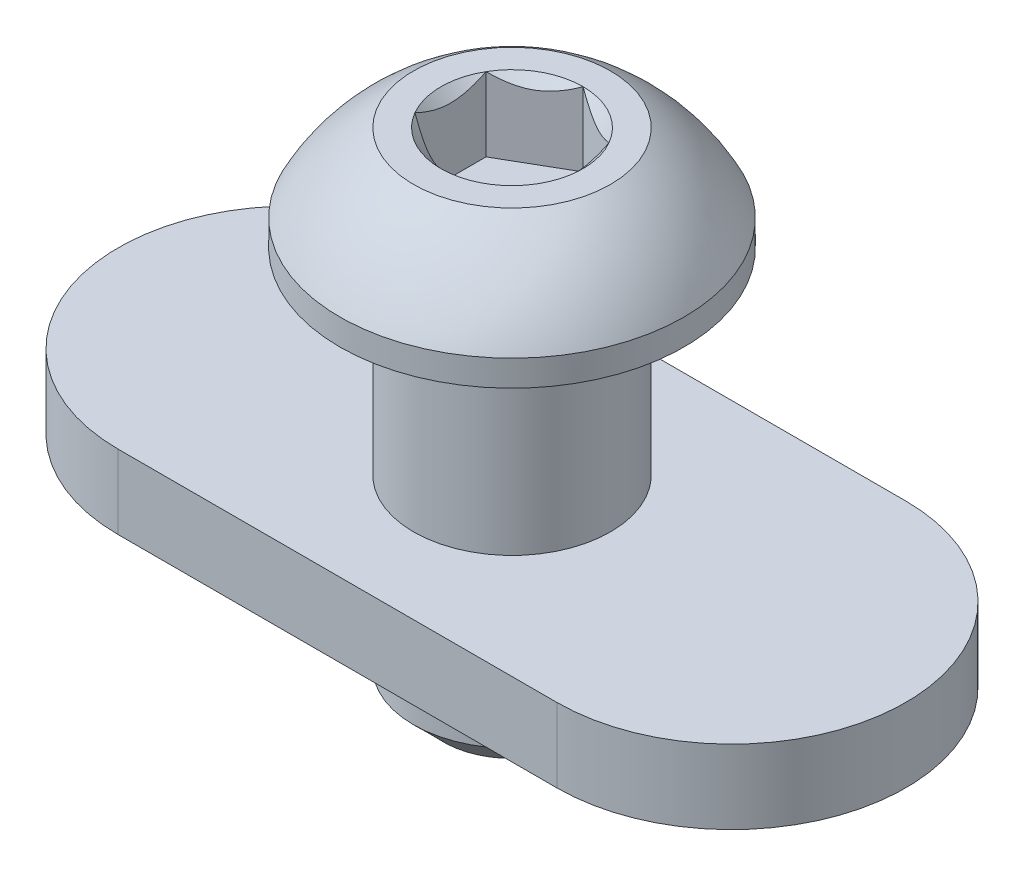
ISO-10303-21;
HEADER;
FILE_DESCRIPTION(('STEP AP214'),'2;1');
FILE_NAME('part.step','',(''),(''),'','','');
FILE_SCHEMA(('AUTOMOTIVE_DESIGN { 1 0 10303 214 1 1 1 1 }'));
ENDSEC;
DATA;
#1=APPLICATION_CONTEXT('core data for automotive mechanical design processes');
#2=APPLICATION_PROTOCOL_DEFINITION('international standard','automotive_design',2000,#1);
#3=PRODUCT_CONTEXT('',#1,'mechanical');
#4=PRODUCT('Part','Part','',(#3));
#5=PRODUCT_RELATED_PRODUCT_CATEGORY('part','',(#4));
#6=PRODUCT_DEFINITION_FORMATION('','',#4);
#7=PRODUCT_DEFINITION_CONTEXT('part definition',#1,'design');
#8=PRODUCT_DEFINITION('design','',#6,#7);
#9=PRODUCT_DEFINITION_SHAPE('','',#8);
#10=(LENGTH_UNIT() NAMED_UNIT(*) SI_UNIT(.MILLI.,.METRE.));
#11=(NAMED_UNIT(*) PLANE_ANGLE_UNIT() SI_UNIT($,.RADIAN.));
#12=(NAMED_UNIT(*) SI_UNIT($,.STERADIAN.) SOLID_ANGLE_UNIT());
#13=UNCERTAINTY_MEASURE_WITH_UNIT(LENGTH_MEASURE(1.E-05),#10,'distance_accuracy_value','');
#14=(GEOMETRIC_REPRESENTATION_CONTEXT(3) GLOBAL_UNCERTAINTY_ASSIGNED_CONTEXT((#13)) GLOBAL_UNIT_ASSIGNED_CONTEXT((#10,
#11,#12)) REPRESENTATION_CONTEXT('',''));
#15=CARTESIAN_POINT('',(0.,0.,0.));
#16=DIRECTION('',(0.,0.,1.));
#17=DIRECTION('',(1.,0.,0.));
#18=AXIS2_PLACEMENT_3D('',#15,#16,#17);
#19=CARTESIAN_POINT('',(-7.0739,-8.7376,0.));
#20=DIRECTION('',(0.,1.,0.));
#21=DIRECTION('',(0.,0.,1.));
#22=AXIS2_PLACEMENT_3D('',#19,#20,#21);
#23=PLANE('',#22);
#24=CARTESIAN_POINT('',(-7.0739,-8.7376,0.));
#25=DIRECTION('',(0.,1.,0.));
#26=DIRECTION('',(0.,0.,1.));
#27=AXIS2_PLACEMENT_3D('',#24,#25,#26);
#28=CIRCLE('',#27,5.6261);
#29=CARTESIAN_POINT('',(-7.0739,-8.7376,-5.6261));
#30=VERTEX_POINT('',#29);
#31=CARTESIAN_POINT('',(-7.0739,-8.7376,5.6261));
#32=VERTEX_POINT('',#31);
#33=EDGE_CURVE('E113',#30,#32,#28,.T.);
#34=ORIENTED_EDGE('',*,*,#33,.F.);
#35=DIRECTION('',(-1.,0.,0.));
#36=VECTOR('',#35,1.);
#37=CARTESIAN_POINT('',(-7.0739,-8.7376,-5.6261));
#38=LINE('',#37,#36);
#39=CARTESIAN_POINT('',(7.0739,-8.7376,-5.6261));
#40=VERTEX_POINT('',#39);
#41=EDGE_CURVE('E110',#40,#30,#38,.T.);
#42=ORIENTED_EDGE('',*,*,#41,.F.);
#43=CARTESIAN_POINT('',(7.0739,-8.7376,0.));
#44=DIRECTION('',(0.,1.,0.));
#45=DIRECTION('',(0.,0.,1.));
#46=AXIS2_PLACEMENT_3D('',#43,#44,#45);
#47=CIRCLE('',#46,5.6261);
#48=CARTESIAN_POINT('',(7.0739,-8.7376,5.6261));
#49=VERTEX_POINT('',#48);
#50=EDGE_CURVE('E102',#49,#40,#47,.T.);
#51=ORIENTED_EDGE('',*,*,#50,.F.);
#52=DIRECTION('',(1.,0.,0.));
#53=VECTOR('',#52,1.);
#54=CARTESIAN_POINT('',(-7.0739,-8.7376,5.6261));
#55=LINE('',#54,#53);
#56=EDGE_CURVE('E109',#32,#49,#55,.T.);
#57=ORIENTED_EDGE('',*,*,#56,.F.);
#58=EDGE_LOOP('',(#34,#42,#51,#57));
#59=FACE_BOUND('',#58,.T.);
#60=CARTESIAN_POINT('',(0.,-8.7376,0.));
#61=DIRECTION('',(0.,1.,0.));
#62=DIRECTION('',(0.,0.,1.));
#63=AXIS2_PLACEMENT_3D('',#60,#61,#62);
#64=CIRCLE('',#63,3.5687);
#65=CARTESIAN_POINT('',(0.,-8.7376,3.5687));
#66=VERTEX_POINT('',#65);
#67=EDGE_CURVE('E13',#66,#66,#64,.F.);
#68=ORIENTED_EDGE('',*,*,#67,.F.);
#69=EDGE_LOOP('',(#68));
#70=FACE_BOUND('',#69,.T.);
#71=ADVANCED_FACE('F52',(#59,#70),#23,.F.);
#72=CARTESIAN_POINT('',(-7.0739,-8.7376,0.));
#73=DIRECTION('',(0.,1.,0.));
#74=DIRECTION('',(0.,0.,1.));
#75=AXIS2_PLACEMENT_3D('',#72,#73,#74);
#76=CYLINDRICAL_SURFACE('',#75,5.6261);
#77=CARTESIAN_POINT('',(-7.0739,-6.35,0.));
#78=DIRECTION('',(0.,1.,0.));
#79=DIRECTION('',(0.,0.,1.));
#80=AXIS2_PLACEMENT_3D('',#77,#78,#79);
#81=CIRCLE('',#80,5.6261);
#82=CARTESIAN_POINT('',(-7.0739,-6.35,-5.6261));
#83=VERTEX_POINT('',#82);
#84=CARTESIAN_POINT('',(-7.0739,-6.35,5.6261));
#85=VERTEX_POINT('',#84);
#86=EDGE_CURVE('E120',#83,#85,#81,.T.);
#87=ORIENTED_EDGE('',*,*,#86,.F.);
#88=DIRECTION('',(0.,1.,0.));
#89=VECTOR('',#88,1.);
#90=CARTESIAN_POINT('',(-7.0739,-8.7376,-5.6261));
#91=LINE('',#90,#89);
#92=EDGE_CURVE('E61',#30,#83,#91,.T.);
#93=ORIENTED_EDGE('',*,*,#92,.F.);
#94=ORIENTED_EDGE('',*,*,#33,.T.);
#95=DIRECTION('',(0.,1.,0.));
#96=VECTOR('',#95,1.);
#97=CARTESIAN_POINT('',(-7.0739,-8.7376,5.6261));
#98=LINE('',#97,#96);
#99=EDGE_CURVE('E96',#32,#85,#98,.T.);
#100=ORIENTED_EDGE('',*,*,#99,.T.);
#101=EDGE_LOOP('',(#87,#93,#94,#100));
#102=FACE_BOUND('',#101,.T.);
#103=ADVANCED_FACE('F54',(#102),#76,.T.);
#104=CARTESIAN_POINT('',(-7.0739,-8.7376,-5.6261));
#105=DIRECTION('',(0.,0.,-1.));
#106=DIRECTION('',(-1.,0.,0.));
#107=AXIS2_PLACEMENT_3D('',#104,#105,#106);
#108=PLANE('',#107);
#109=DIRECTION('',(-1.,0.,0.));
#110=VECTOR('',#109,1.);
#111=CARTESIAN_POINT('',(-7.0739,-6.35,-5.6261));
#112=LINE('',#111,#110);
#113=CARTESIAN_POINT('',(7.0739,-6.35,-5.6261));
#114=VERTEX_POINT('',#113);
#115=EDGE_CURVE('E115',#114,#83,#112,.T.);
#116=ORIENTED_EDGE('',*,*,#115,.F.);
#117=DIRECTION('',(0.,1.,0.));
#118=VECTOR('',#117,1.);
#119=CARTESIAN_POINT('',(7.0739,-8.7376,-5.6261));
#120=LINE('',#119,#118);
#121=EDGE_CURVE('E85',#40,#114,#120,.T.);
#122=ORIENTED_EDGE('',*,*,#121,.F.);
#123=ORIENTED_EDGE('',*,*,#41,.T.);
#124=ORIENTED_EDGE('',*,*,#92,.T.);
#125=EDGE_LOOP('',(#116,#122,#123,#124));
#126=FACE_BOUND('',#125,.T.);
#127=ADVANCED_FACE('F132',(#126),#108,.T.);
#128=CARTESIAN_POINT('',(7.0739,-8.7376,0.));
#129=DIRECTION('',(0.,1.,0.));
#130=DIRECTION('',(0.,0.,1.));
#131=AXIS2_PLACEMENT_3D('',#128,#129,#130);
#132=CYLINDRICAL_SURFACE('',#131,5.6261);
#133=CARTESIAN_POINT('',(7.0739,-6.35,0.));
#134=DIRECTION('',(0.,1.,0.));
#135=DIRECTION('',(0.,0.,1.));
#136=AXIS2_PLACEMENT_3D('',#133,#134,#135);
#137=CIRCLE('',#136,5.6261);
#138=CARTESIAN_POINT('',(7.0739,-6.35,5.6261));
#139=VERTEX_POINT('',#138);
#140=EDGE_CURVE('E104',#139,#114,#137,.T.);
#141=ORIENTED_EDGE('',*,*,#140,.F.);
#142=DIRECTION('',(0.,1.,0.));
#143=VECTOR('',#142,1.);
#144=CARTESIAN_POINT('',(7.0739,-8.7376,5.6261));
#145=LINE('',#144,#143);
#146=EDGE_CURVE('E99',#49,#139,#145,.T.);
#147=ORIENTED_EDGE('',*,*,#146,.F.);
#148=ORIENTED_EDGE('',*,*,#50,.T.);
#149=ORIENTED_EDGE('',*,*,#121,.T.);
#150=EDGE_LOOP('',(#141,#147,#148,#149));
#151=FACE_BOUND('',#150,.T.);
#152=ADVANCED_FACE('F101',(#151),#132,.T.);
#153=CARTESIAN_POINT('',(-7.0739,-8.7376,5.6261));
#154=DIRECTION('',(0.,0.,1.));
#155=DIRECTION('',(1.,0.,0.));
#156=AXIS2_PLACEMENT_3D('',#153,#154,#155);
#157=PLANE('',#156);
#158=DIRECTION('',(1.,0.,0.));
#159=VECTOR('',#158,1.);
#160=CARTESIAN_POINT('',(-7.0739,-6.35,5.6261));
#161=LINE('',#160,#159);
#162=EDGE_CURVE('E123',#85,#139,#161,.T.);
#163=ORIENTED_EDGE('',*,*,#162,.F.);
#164=ORIENTED_EDGE('',*,*,#99,.F.);
#165=ORIENTED_EDGE('',*,*,#56,.T.);
#166=ORIENTED_EDGE('',*,*,#146,.T.);
#167=EDGE_LOOP('',(#163,#164,#165,#166));
#168=FACE_BOUND('',#167,.T.);
#169=ADVANCED_FACE('F112',(#168),#157,.T.);
#170=CARTESIAN_POINT('',(-7.0739,-6.35,0.));
#171=DIRECTION('',(0.,1.,0.));
#172=DIRECTION('',(0.,0.,1.));
#173=AXIS2_PLACEMENT_3D('',#170,#171,#172);
#174=PLANE('',#173);
#175=CARTESIAN_POINT('',(0.,-6.35,0.));
#176=DIRECTION('',(0.,1.,0.));
#177=DIRECTION('',(0.,0.,1.));
#178=AXIS2_PLACEMENT_3D('',#175,#176,#177);
#179=CIRCLE('',#178,3.175);
#180=CARTESIAN_POINT('',(0.,-6.35,3.175));
#181=VERTEX_POINT('',#180);
#182=EDGE_CURVE('E124',#181,#181,#179,.T.);
#183=ORIENTED_EDGE('',*,*,#182,.F.);
#184=EDGE_LOOP('',(#183));
#185=FACE_BOUND('',#184,.T.);
#186=ORIENTED_EDGE('',*,*,#86,.T.);
#187=ORIENTED_EDGE('',*,*,#162,.T.);
#188=ORIENTED_EDGE('',*,*,#140,.T.);
#189=ORIENTED_EDGE('',*,*,#115,.T.);
#190=EDGE_LOOP('',(#186,#187,#188,#189));
#191=FACE_BOUND('',#190,.T.);
#192=ADVANCED_FACE('F131',(#185,#191),#174,.T.);
#193=CARTESIAN_POINT('',(0.,-8.7376,0.));
#194=DIRECTION('',(0.,1.,0.));
#195=DIRECTION('',(0.,0.,1.));
#196=AXIS2_PLACEMENT_3D('',#193,#194,#195);
#197=CYLINDRICAL_SURFACE('',#196,3.175);
#198=ORIENTED_EDGE('',*,*,#182,.T.);
#199=EDGE_LOOP('',(#198));
#200=FACE_BOUND('',#199,.T.);
#201=CARTESIAN_POINT('',(0.,-9.4996,0.));
#202=DIRECTION('',(0.,-1.,0.));
#203=DIRECTION('',(0.,0.,-1.));
#204=AXIS2_PLACEMENT_3D('',#201,#202,#203);
#205=CIRCLE('',#204,3.175);
#206=CARTESIAN_POINT('',(0.,-9.4996,-3.175));
#207=VERTEX_POINT('',#206);
#208=EDGE_CURVE('E160',#207,#207,#205,.T.);
#209=ORIENTED_EDGE('',*,*,#208,.T.);
#210=EDGE_LOOP('',(#209));
#211=FACE_BOUND('',#210,.T.);
#212=ADVANCED_FACE('F146',(#200,#211),#197,.F.);
#213=CARTESIAN_POINT('',(0.,-9.4996,0.));
#214=DIRECTION('',(0.,-1.,0.));
#215=DIRECTION('',(0.,0.,-1.));
#216=AXIS2_PLACEMENT_3D('',#213,#214,#215);
#217=PLANE('',#216);
#218=CARTESIAN_POINT('',(0.,-9.4996,0.));
#219=DIRECTION('',(0.,-1.,0.));
#220=DIRECTION('',(0.,0.,-1.));
#221=AXIS2_PLACEMENT_3D('',#218,#219,#220);
#222=CIRCLE('',#221,3.5687);
#223=CARTESIAN_POINT('',(0.,-9.4996,3.5687));
#224=VERTEX_POINT('',#223);
#225=EDGE_CURVE('E158',#224,#224,#222,.T.);
#226=ORIENTED_EDGE('',*,*,#225,.T.);
#227=EDGE_LOOP('',(#226));
#228=FACE_BOUND('',#227,.T.);
#229=ORIENTED_EDGE('',*,*,#208,.F.);
#230=EDGE_LOOP('',(#229));
#231=FACE_BOUND('',#230,.T.);
#232=ADVANCED_FACE('F154',(#228,#231),#217,.T.);
#233=CARTESIAN_POINT('',(0.,-9.4996,0.));
#234=DIRECTION('',(0.,1.,0.));
#235=DIRECTION('',(0.,0.,1.));
#236=AXIS2_PLACEMENT_3D('',#233,#234,#235);
#237=CYLINDRICAL_SURFACE('',#236,3.5687);
#238=CARTESIAN_POINT('',(0.,-9.4996,3.5687));
#239=CARTESIAN_POINT('',(0.,-9.4916625,3.5687));
#240=CARTESIAN_POINT('',(0.,-9.483725,3.5687));
#241=CARTESIAN_POINT('',(0.,-9.46785,3.5687));
#242=CARTESIAN_POINT('',(0.,-9.4599125,3.5687));
#243=CARTESIAN_POINT('',(0.,-9.4440375,3.5687));
#244=CARTESIAN_POINT('',(0.,-9.4361,3.5687));
#245=CARTESIAN_POINT('',(0.,-9.420225,3.5687));
#246=CARTESIAN_POINT('',(0.,-9.4122875,3.5687));
#247=CARTESIAN_POINT('',(0.,-9.3964125,3.5687));
#248=CARTESIAN_POINT('',(0.,-9.388475,3.5687));
#249=CARTESIAN_POINT('',(0.,-9.3726,3.5687));
#250=CARTESIAN_POINT('',(0.,-9.3646625,3.5687));
#251=CARTESIAN_POINT('',(0.,-9.3487875,3.5687));
#252=CARTESIAN_POINT('',(0.,-9.34085,3.5687));
#253=CARTESIAN_POINT('',(0.,-9.324975,3.5687));
#254=CARTESIAN_POINT('',(0.,-9.3170375,3.5687));
#255=CARTESIAN_POINT('',(0.,-9.3011625,3.5687));
#256=CARTESIAN_POINT('',(0.,-9.293225,3.5687));
#257=CARTESIAN_POINT('',(0.,-9.27735,3.5687));
#258=CARTESIAN_POINT('',(0.,-9.2694125,3.5687));
#259=CARTESIAN_POINT('',(0.,-9.2535375,3.5687));
#260=CARTESIAN_POINT('',(0.,-9.2456,3.5687));
#261=CARTESIAN_POINT('',(0.,-9.229725,3.5687));
#262=CARTESIAN_POINT('',(0.,-9.2217875,3.5687));
#263=CARTESIAN_POINT('',(0.,-9.2059125,3.5687));
#264=CARTESIAN_POINT('',(0.,-9.197975,3.5687));
#265=CARTESIAN_POINT('',(0.,-9.1821,3.5687));
#266=CARTESIAN_POINT('',(0.,-9.1741625,3.5687));
#267=CARTESIAN_POINT('',(0.,-9.1582875,3.5687));
#268=CARTESIAN_POINT('',(0.,-9.15035,3.5687));
#269=CARTESIAN_POINT('',(0.,-9.134475,3.5687));
#270=CARTESIAN_POINT('',(0.,-9.1265375,3.5687));
#271=CARTESIAN_POINT('',(0.,-9.1106625,3.5687));
#272=CARTESIAN_POINT('',(0.,-9.102725,3.5687));
#273=CARTESIAN_POINT('',(0.,-9.08685,3.5687));
#274=CARTESIAN_POINT('',(0.,-9.0789125,3.5687));
#275=CARTESIAN_POINT('',(0.,-9.0630375,3.5687));
#276=CARTESIAN_POINT('',(0.,-9.0551,3.5687));
#277=CARTESIAN_POINT('',(0.,-9.039225,3.5687));
#278=CARTESIAN_POINT('',(0.,-9.0312875,3.5687));
#279=CARTESIAN_POINT('',(0.,-9.0154125,3.5687));
#280=CARTESIAN_POINT('',(0.,-9.007475,3.5687));
#281=CARTESIAN_POINT('',(0.,-8.9916,3.5687));
#282=CARTESIAN_POINT('',(0.,-8.9836625,3.5687));
#283=CARTESIAN_POINT('',(0.,-8.9677875,3.5687));
#284=CARTESIAN_POINT('',(0.,-8.95985,3.5687));
#285=CARTESIAN_POINT('',(0.,-8.943975,3.5687));
#286=CARTESIAN_POINT('',(0.,-8.9360375,3.5687));
#287=CARTESIAN_POINT('',(0.,-8.9201625,3.5687));
#288=CARTESIAN_POINT('',(0.,-8.912225,3.5687));
#289=CARTESIAN_POINT('',(0.,-8.89635,3.5687));
#290=CARTESIAN_POINT('',(0.,-8.8884125,3.5687));
#291=CARTESIAN_POINT('',(0.,-8.8725375,3.5687));
#292=CARTESIAN_POINT('',(0.,-8.8646,3.5687));
#293=CARTESIAN_POINT('',(0.,-8.848725,3.5687));
#294=CARTESIAN_POINT('',(0.,-8.8407875,3.5687));
#295=CARTESIAN_POINT('',(0.,-8.8249125,3.5687));
#296=CARTESIAN_POINT('',(0.,-8.816975,3.5687));
#297=CARTESIAN_POINT('',(0.,-8.8011,3.5687));
#298=CARTESIAN_POINT('',(0.,-8.7931625,3.5687));
#299=CARTESIAN_POINT('',(0.,-8.7772875,3.5687));
#300=CARTESIAN_POINT('',(0.,-8.76935,3.5687));
#301=CARTESIAN_POINT('',(0.,-8.753475,3.5687));
#302=CARTESIAN_POINT('',(0.,-8.7455375,3.5687));
#303=CARTESIAN_POINT('',(0.,-8.7376,3.5687));
#304=B_SPLINE_CURVE_WITH_KNOTS('',3,(#238,#239,#240,#241,#242,#243,#244,#245,#246,#247,#248,
#249,#250,#251,#252,#253,#254,#255,#256,#257,#258,#259,#260,#261,#262,#263,#264,#265,#266,#267,
#268,#269,#270,#271,#272,#273,#274,#275,#276,#277,#278,#279,#280,#281,#282,#283,#284,#285,#286,
#287,#288,#289,#290,#291,#292,#293,#294,#295,#296,#297,#298,#299,#300,#301,#302,#303),
.UNSPECIFIED.,.F.,.F.,(4,2,2,2,2,2,2,2,2,2,2,2,2,2,2,2,2,2,2,2,2,2,2,2,2,2,2,2,2,2,2,2,4),(0.,
0.0238125000000013,0.0476250000000008,0.0714375000000003,0.0952499999999998,0.119062500000001,
0.142875000000001,0.1666875,0.1905,0.214312500000001,0.238125,0.2619375,0.28575,
0.309562500000001,0.333375,0.3571875,0.380999999999999,0.404812500000001,0.428625,0.4524375,
0.476249999999999,0.500062500000001,0.523875,0.5476875,0.571499999999999,0.5953125,0.619125,
0.642937499999999,0.666749999999999,0.6905625,0.714375,0.738187499999999,0.761999999999999),.UNSPECIFIED.);
#305=EDGE_CURVE('BSEAM168',#224,#66,#304,.T.);
#306=ORIENTED_EDGE('',*,*,#225,.F.);
#307=ORIENTED_EDGE('',*,*,#67,.T.);
#308=ORIENTED_EDGE('',*,*,#305,.T.);
#309=ORIENTED_EDGE('',*,*,#305,.F.);
#310=EDGE_LOOP('',(#306,#308,#307,#309));
#311=FACE_BOUND('',#310,.T.);
#312=ADVANCED_FACE('F168',(#311),#237,.T.);
#313=CLOSED_SHELL('',(#71,#103,#127,#152,#169,#192,#212,#232,#312));
#314=MANIFOLD_SOLID_BREP('B2',#313);
#315=CARTESIAN_POINT('',(0.,-12.7,0.));
#316=DIRECTION('',(0.,1.,0.));
#317=DIRECTION('',(0.,0.,1.));
#318=AXIS2_PLACEMENT_3D('',#315,#316,#317);
#319=CYLINDRICAL_SURFACE('',#318,3.175);
#320=CARTESIAN_POINT('',(0.,0.,0.));
#321=DIRECTION('',(0.,1.,0.));
#322=DIRECTION('',(0.,0.,1.));
#323=AXIS2_PLACEMENT_3D('',#320,#321,#322);
#324=CIRCLE('',#323,3.175);
#325=CARTESIAN_POINT('',(0.,0.,3.175));
#326=VERTEX_POINT('',#325);
#327=EDGE_CURVE('E244',#326,#326,#324,.T.);
#328=ORIENTED_EDGE('',*,*,#327,.F.);
#329=EDGE_LOOP('',(#328));
#330=FACE_BOUND('',#329,.T.);
#331=CARTESIAN_POINT('',(0.,-11.7376292700446,0.));
#332=DIRECTION('',(0.,1.,0.));
#333=DIRECTION('',(0.,0.,1.));
#334=AXIS2_PLACEMENT_3D('',#331,#332,#333);
#335=CIRCLE('',#334,3.175);
#336=CARTESIAN_POINT('',(0.,-11.7376292700446,3.175));
#337=VERTEX_POINT('',#336);
#338=EDGE_CURVE('E373',#337,#337,#335,.T.);
#339=ORIENTED_EDGE('',*,*,#338,.T.);
#340=EDGE_LOOP('',(#339));
#341=FACE_BOUND('',#340,.T.);
#342=ADVANCED_FACE('F230',(#330,#341),#319,.T.);
#343=CARTESIAN_POINT('',(0.,-12.7,0.));
#344=DIRECTION('',(0.,1.,0.));
#345=DIRECTION('',(0.,0.,-1.));
#346=AXIS2_PLACEMENT_3D('',#343,#344,#345);
#347=CONICAL_SURFACE('',#346,2.21262927004457,0.78539816339745);
#348=ORIENTED_EDGE('',*,*,#338,.F.);
#349=EDGE_LOOP('',(#348));
#350=FACE_BOUND('',#349,.T.);
#351=CARTESIAN_POINT('',(0.,-12.7,0.));
#352=DIRECTION('',(0.,-1.,0.));
#353=DIRECTION('',(0.,0.,-1.));
#354=AXIS2_PLACEMENT_3D('',#351,#352,#353);
#355=CIRCLE('',#354,2.21262927004457);
#356=CARTESIAN_POINT('',(0.,-12.7,-2.21262927004457));
#357=VERTEX_POINT('',#356);
#358=EDGE_CURVE('E369',#357,#357,#355,.T.);
#359=ORIENTED_EDGE('',*,*,#358,.F.);
#360=EDGE_LOOP('',(#359));
#361=FACE_BOUND('',#360,.T.);
#362=ADVANCED_FACE('F385',(#350,#361),#347,.T.);
#363=CARTESIAN_POINT('',(0.,-12.7,0.));
#364=DIRECTION('',(0.,1.,0.));
#365=DIRECTION('',(0.,0.,1.));
#366=AXIS2_PLACEMENT_3D('',#363,#364,#365);
#367=PLANE('',#366);
#368=ORIENTED_EDGE('',*,*,#358,.T.);
#369=EDGE_LOOP('',(#368));
#370=FACE_BOUND('',#369,.T.);
#371=ADVANCED_FACE('F390',(#370),#367,.F.);
#372=CARTESIAN_POINT('',(5.5499,0.,0.));
#373=DIRECTION('',(0.,1.,0.));
#374=DIRECTION('',(0.,0.,1.));
#375=AXIS2_PLACEMENT_3D('',#372,#373,#374);
#376=PLANE('',#375);
#377=ORIENTED_EDGE('',*,*,#327,.T.);
#378=EDGE_LOOP('',(#377));
#379=FACE_BOUND('',#378,.T.);
#380=CARTESIAN_POINT('',(0.,0.,0.));
#381=DIRECTION('',(0.,-1.,0.));
#382=DIRECTION('',(0.,0.,-1.));
#383=AXIS2_PLACEMENT_3D('',#380,#381,#382);
#384=CIRCLE('',#383,5.5499);
#385=CARTESIAN_POINT('',(0.,0.,-5.5499));
#386=VERTEX_POINT('',#385);
#387=EDGE_CURVE('E343',#386,#386,#384,.T.);
#388=ORIENTED_EDGE('',*,*,#387,.T.);
#389=EDGE_LOOP('',(#388));
#390=FACE_BOUND('',#389,.T.);
#391=ADVANCED_FACE('F380',(#379,#390),#376,.F.);
#392=CARTESIAN_POINT('',(0.,3.3528,0.));
#393=DIRECTION('',(0.,-1.,0.));
#394=DIRECTION('',(0.,0.,-1.));
#395=AXIS2_PLACEMENT_3D('',#392,#393,#394);
#396=PLANE('',#395);
#397=CARTESIAN_POINT('',(0.,3.3528,0.));
#398=DIRECTION('',(0.,1.,0.));
#399=DIRECTION('',(0.,0.,1.));
#400=AXIS2_PLACEMENT_3D('',#397,#398,#399);
#401=CIRCLE('',#400,2.29135888084633);
#402=CARTESIAN_POINT('',(0.,3.3528,-2.29135888084633));
#403=VERTEX_POINT('',#402);
#404=CARTESIAN_POINT('',(-1.984375,3.3528,-1.14567944042316));
#405=VERTEX_POINT('',#404);
#406=EDGE_CURVE('E494',#403,#405,#401,.T.);
#407=ORIENTED_EDGE('',*,*,#406,.F.);
#408=CARTESIAN_POINT('',(1.984375,3.3528,-1.14567944042317));
#409=VERTEX_POINT('',#408);
#410=EDGE_CURVE('E488',#409,#403,#401,.T.);
#411=ORIENTED_EDGE('',*,*,#410,.F.);
#412=CARTESIAN_POINT('',(1.984375,3.3528,1.14567944042316));
#413=VERTEX_POINT('',#412);
#414=EDGE_CURVE('E250',#413,#409,#401,.T.);
#415=ORIENTED_EDGE('',*,*,#414,.F.);
#416=CARTESIAN_POINT('',(0.,3.3528,2.29135888084633));
#417=VERTEX_POINT('',#416);
#418=EDGE_CURVE('E257',#417,#413,#401,.T.);
#419=ORIENTED_EDGE('',*,*,#418,.F.);
#420=CARTESIAN_POINT('',(-1.984375,3.3528,1.14567944042316));
#421=VERTEX_POINT('',#420);
#422=EDGE_CURVE('E484',#421,#417,#401,.T.);
#423=ORIENTED_EDGE('',*,*,#422,.F.);
#424=EDGE_CURVE('E490',#405,#421,#401,.T.);
#425=ORIENTED_EDGE('',*,*,#424,.F.);
#426=EDGE_LOOP('',(#407,#411,#415,#419,#423,#425));
#427=FACE_BOUND('',#426,.T.);
#428=CARTESIAN_POINT('',(0.,3.3528,0.));
#429=DIRECTION('',(0.,-1.,0.));
#430=DIRECTION('',(0.,0.,-1.));
#431=AXIS2_PLACEMENT_3D('',#428,#429,#430);
#432=CIRCLE('',#431,3.175);
#433=CARTESIAN_POINT('',(3.175,3.3528,0.));
#434=VERTEX_POINT('',#433);
#435=EDGE_CURVE('E365',#434,#434,#432,.T.);
#436=ORIENTED_EDGE('',*,*,#435,.F.);
#437=EDGE_LOOP('',(#436));
#438=FACE_BOUND('',#437,.T.);
#439=ADVANCED_FACE('F398',(#427,#438),#396,.F.);
#440=CARTESIAN_POINT('',(0.,-2.02459166666667,0.));
#441=DIRECTION('',(0.,-1.,0.));
#442=DIRECTION('',(1.,0.,0.));
#443=AXIS2_PLACEMENT_3D('',#440,#441,#442);
#444=SPHERICAL_SURFACE('',#443,6.2447550902126);
#445=CARTESIAN_POINT('',(0.,0.838200000000001,0.));
#446=DIRECTION('',(0.,-1.,0.));
#447=DIRECTION('',(0.,0.,-1.));
#448=AXIS2_PLACEMENT_3D('',#445,#446,#447);
#449=CIRCLE('',#448,5.5499);
#450=CARTESIAN_POINT('',(5.5499,0.838200000000001,0.));
#451=VERTEX_POINT('',#450);
#452=EDGE_CURVE('E361',#451,#451,#449,.T.);
#453=CARTESIAN_POINT('',(5.5499,0.838200000000001,0.));
#454=CARTESIAN_POINT('',(5.53316432220688,0.870644400352652,0.));
#455=CARTESIAN_POINT('',(5.51614408130253,0.902942013986527,0.));
#456=CARTESIAN_POINT('',(5.4815398448907,0.967233807731947,0.));
#457=CARTESIAN_POINT('',(5.46395584938322,0.999227987843493,0.));
#458=CARTESIAN_POINT('',(5.42822947538451,1.06290305445948,0.));
#459=CARTESIAN_POINT('',(5.41008709689326,1.09458394096392,0.));
#460=CARTESIAN_POINT('',(5.37324954674706,1.15762268164647,0.));
#461=CARTESIAN_POINT('',(5.35455437509209,1.18898053582458,0.));
#462=CARTESIAN_POINT('',(5.31661698601056,1.25136356578887,0.));
#463=CARTESIAN_POINT('',(5.297374768584,1.28238874157506,0.));
#464=CARTESIAN_POINT('',(5.25834920694046,1.34409687280633,0.));
#465=CARTESIAN_POINT('',(5.23856586272349,1.3747798282514,0.));
#466=CARTESIAN_POINT('',(5.19846413201942,1.43579408162594,0.));
#467=CARTESIAN_POINT('',(5.17814574553232,1.46612537955541,0.));
#468=CARTESIAN_POINT('',(5.13698017960928,1.52642698901148,0.));
#469=CARTESIAN_POINT('',(5.11613300017333,1.55639730053808,0.));
#470=CARTESIAN_POINT('',(5.07391626024907,1.61596771929423,0.));
#471=CARTESIAN_POINT('',(5.05254669976077,1.64556782652378,0.));
#472=CARTESIAN_POINT('',(5.00929177031282,1.70438873266362,0.));
#473=CARTESIAN_POINT('',(4.98740640135317,1.73360953157391,0.));
#474=CARTESIAN_POINT('',(4.94312658618473,1.79166283371336,0.));
#475=CARTESIAN_POINT('',(4.92073213997594,1.82049533694253,0.));
#476=CARTESIAN_POINT('',(4.87544105810816,1.87776317978557,0.));
#477=CARTESIAN_POINT('',(4.85254442244916,1.90619851939946,0.));
#478=CARTESIAN_POINT('',(4.80625600393662,1.96266328923213,0.));
#479=CARTESIAN_POINT('',(4.78286422108308,1.99069271945092,0.));
#480=CARTESIAN_POINT('',(4.73559270272823,2.0463370495581,0.));
#481=CARTESIAN_POINT('',(4.71171296722693,2.07395194944648,0.));
#482=CARTESIAN_POINT('',(4.66347288820163,2.12875872545349,0.));
#483=CARTESIAN_POINT('',(4.63911254467763,2.1559506015721,0.));
#484=CARTESIAN_POINT('',(4.58991874205127,2.20990296670847,0.));
#485=CARTESIAN_POINT('',(4.56508528294891,2.23666345572621,0.));
#486=CARTESIAN_POINT('',(4.51495288712505,2.2897448160103,0.));
#487=CARTESIAN_POINT('',(4.48965395040355,2.31606568727664,0.));
#488=CARTESIAN_POINT('',(4.4385983804663,2.36825971661939,0.));
#489=CARTESIAN_POINT('',(4.41284174725056,2.3941328746958,0.));
#490=CARTESIAN_POINT('',(4.36087870622217,2.44542351992211,0.));
#491=CARTESIAN_POINT('',(4.33467229840953,2.47084100707201,0.));
#492=CARTESIAN_POINT('',(4.28181776842067,2.52121249285817,0.));
#493=CARTESIAN_POINT('',(4.25516964624444,2.54616649149444,0.));
#494=CARTESIAN_POINT('',(4.20143988361858,2.59560332522008,0.));
#495=CARTESIAN_POINT('',(4.17435824316893,2.62008616030945,0.));
#496=CARTESIAN_POINT('',(4.11976977342249,2.66857313682265,0.));
#497=CARTESIAN_POINT('',(4.09226294412568,2.69257727824647,0.));
#498=CARTESIAN_POINT('',(4.03683255688514,2.74009948454005,0.));
#499=CARTESIAN_POINT('',(4.00890899894141,2.76361754940982,0.));
#500=CARTESIAN_POINT('',(3.95265374278007,2.81016036920923,0.));
#501=CARTESIAN_POINT('',(3.92432204456246,2.83318512413888,0.));
#502=CARTESIAN_POINT('',(3.86725922175427,2.87873424239354,0.));
#503=CARTESIAN_POINT('',(3.8385280971637,2.90125860571856,0.));
#504=CARTESIAN_POINT('',(3.78067525837119,2.94580001302013,0.));
#505=CARTESIAN_POINT('',(3.75155354416926,2.9678170569967,0.));
#506=CARTESIAN_POINT('',(3.69292848301008,3.0113370538303,0.));
#507=CARTESIAN_POINT('',(3.66342513605284,3.03284000668734,0.));
#508=CARTESIAN_POINT('',(3.60404588375918,3.07532520786016,0.));
#509=CARTESIAN_POINT('',(3.57416997842277,3.09630745617594,0.));
#510=CARTESIAN_POINT('',(3.51405479780239,3.13774479413132,0.));
#511=CARTESIAN_POINT('',(3.48381552251841,3.15819988377091,0.));
#512=CARTESIAN_POINT('',(3.42298290417811,3.19857661560349,0.));
#513=CARTESIAN_POINT('',(3.39238956112179,3.21849825779647,0.));
#514=CARTESIAN_POINT('',(3.33085821091131,3.25780195799023,0.));
#515=CARTESIAN_POINT('',(3.29992020375714,3.27718401599101,0.));
#516=CARTESIAN_POINT('',(3.23770906265146,3.31540262197001,0.));
#517=CARTESIAN_POINT('',(3.20643592869994,3.33423916994823,0.));
#518=CARTESIAN_POINT('',(3.175,3.3528,0.));
#519=B_SPLINE_CURVE_WITH_KNOTS('',3,(#453,#454,#455,#456,#457,#458,#459,#460,#461,#462,#463,
#464,#465,#466,#467,#468,#469,#470,#471,#472,#473,#474,#475,#476,#477,#478,#479,#480,#481,#482,
#483,#484,#485,#486,#487,#488,#489,#490,#491,#492,#493,#494,#495,#496,#497,#498,#499,#500,#501,
#502,#503,#504,#505,#506,#507,#508,#509,#510,#511,#512,#513,#514,#515,#516,#517,#518),
.UNSPECIFIED.,.F.,.F.,(4,2,2,2,2,2,2,2,2,2,2,2,2,2,2,2,2,2,2,2,2,2,2,2,2,2,2,2,2,2,2,2,4),(0.,
0.109517991230185,0.21903598246037,0.328553973690554,0.438071964920738,0.547589956150923,
0.657107947381109,0.766625938611293,0.876143929841478,0.985661921071662,1.09517991230185,
1.20469790353203,1.31421589476222,1.4237338859924,1.53325187722259,1.64276986845277,
1.75228785968295,1.86180585091314,1.97132384214332,2.08084183337351,2.19035982460369,
2.29987781583388,2.40939580706406,2.51891379829425,2.62843178952443,2.73794978075462,
2.8474677719848,2.95698576321499,3.06650375444517,3.17602174567536,3.28553973690554,
3.39505772813573,3.50457571936591),.UNSPECIFIED.);
#520=EDGE_CURVE('BSEAM403',#451,#434,#519,.T.);
#521=ORIENTED_EDGE('',*,*,#452,.F.);
#522=ORIENTED_EDGE('',*,*,#435,.T.);
#523=ORIENTED_EDGE('',*,*,#520,.T.);
#524=ORIENTED_EDGE('',*,*,#520,.F.);
#525=EDGE_LOOP('',(#521,#523,#522,#524));
#526=FACE_BOUND('',#525,.T.);
#527=ADVANCED_FACE('F403',(#526),#444,.T.);
#528=CARTESIAN_POINT('',(0.,0.,0.));
#529=DIRECTION('',(0.,-1.,0.));
#530=DIRECTION('',(0.,0.,-1.));
#531=AXIS2_PLACEMENT_3D('',#528,#529,#530);
#532=CYLINDRICAL_SURFACE('',#531,5.5499);
#533=ORIENTED_EDGE('',*,*,#387,.F.);
#534=EDGE_LOOP('',(#533));
#535=FACE_BOUND('',#534,.T.);
#536=ORIENTED_EDGE('',*,*,#452,.T.);
#537=EDGE_LOOP('',(#536));
#538=FACE_BOUND('',#537,.T.);
#539=ADVANCED_FACE('F407',(#535,#538),#532,.T.);
#540=CARTESIAN_POINT('',(0.,3.3528,0.));
#541=DIRECTION('',(0.,1.,0.));
#542=DIRECTION('',(0.,0.,1.));
#543=AXIS2_PLACEMENT_3D('',#540,#541,#542);
#544=CONICAL_SURFACE('',#543,2.29135888084633,0.78539816339745);
#545=ORIENTED_EDGE('',*,*,#406,.T.);
#546=CARTESIAN_POINT('',(0.000200000000000088,3.35291547878184,-2.29147435090017));
#547=CARTESIAN_POINT('',(-0.0680159951668024,3.31356285226391,-2.25208982772757));
#548=CARTESIAN_POINT('',(-0.137372685106966,3.27652131044618,-2.21204672412052));
#549=CARTESIAN_POINT('',(-0.278798800452187,3.20869885842332,-2.13039431835551));
#550=CARTESIAN_POINT('',(-0.350881678736782,3.17795568909175,-2.08877724917394));
#551=CARTESIAN_POINT('',(-0.496233397266004,3.12529188881121,-2.00485839535392));
#552=CARTESIAN_POINT('',(-0.569465212486938,3.10323887587996,-1.96257798712287));
#553=CARTESIAN_POINT('',(-0.717541182594706,3.06926149294388,-1.87708628592063));
#554=CARTESIAN_POINT('',(-0.792380812753425,3.05731175609173,-1.83387760530244));
#555=CARTESIAN_POINT('',(-0.921360414543816,3.04653009908191,-1.75941119748879));
#556=CARTESIAN_POINT('',(-0.975333715772442,3.04493389905907,-1.72824969749539));
#557=CARTESIAN_POINT('',(-1.0831921185198,3.04762183886529,-1.66597761963484));
#558=CARTESIAN_POINT('',(-1.13707718248552,3.05190804034046,-1.63486706344893));
#559=CARTESIAN_POINT('',(-1.2443385382486,3.06611687301352,-1.57293969082547));
#560=CARTESIAN_POINT('',(-1.29771419276014,3.07604581045227,-1.54212324232506));
#561=CARTESIAN_POINT('',(-1.4035425174089,3.10099508427454,-1.48102323060122));
#562=CARTESIAN_POINT('',(-1.4559952579711,3.11601503038949,-1.45073962671789));
#563=CARTESIAN_POINT('',(-1.59035733896365,3.16060785163567,-1.37316564308797));
#564=CARTESIAN_POINT('',(-1.67143335715832,3.19354299593833,-1.32635638215845));
#565=CARTESIAN_POINT('',(-1.79064830672984,3.2491424412022,-1.25752759893191));
#566=CARTESIAN_POINT('',(-1.829934924386,3.26867759205186,-1.23484545965257));
#567=CARTESIAN_POINT('',(-1.90778036186805,3.3095287381194,-1.18990137536713));
#568=CARTESIAN_POINT('',(-1.9463396111017,3.33084363956835,-1.16763918244233));
#569=CARTESIAN_POINT('',(-1.984575,3.35291547878184,-1.14556397036933));
#570=B_SPLINE_CURVE_WITH_KNOTS('',3,(#546,#547,#548,#549,#550,#551,#552,#553,#554,#555,#556,
#557,#558,#559,#560,#561,#562,#563,#564,#565,#566,#567,#568,#569),.UNSPECIFIED.,.F.,.F.,(4,2,2,
2,2,2,2,2,2,2,2,4),(0.,0.264339630306627,0.530219665093694,0.79187641637146,1.05287424418109,
1.239639843932,1.42647091743852,1.61351120244035,1.8005371524754,2.09764209964316,
2.24579179873714,2.39385111134157),.UNSPECIFIED.);
#571=EDGE_CURVE('E50',#403,#405,#570,.T.);
#572=ORIENTED_EDGE('',*,*,#571,.F.);
#573=EDGE_LOOP('',(#545,#572));
#574=FACE_BOUND('',#573,.T.);
#575=ADVANCED_FACE('F410',(#574),#544,.F.);
#576=ORIENTED_EDGE('',*,*,#424,.T.);
#577=CARTESIAN_POINT('',(-1.984375,4.08778407881657,-2.28495242157822));
#578=CARTESIAN_POINT('',(-1.984375,4.04578668555076,-2.22931635455402));
#579=CARTESIAN_POINT('',(-1.984375,4.00419605407633,-2.17336876548389));
#580=CARTESIAN_POINT('',(-1.984375,3.92200846147148,-2.06072770258171));
#581=CARTESIAN_POINT('',(-1.984375,3.88141175240504,-2.00403404503435));
#582=CARTESIAN_POINT('',(-1.984375,3.80110350317467,-1.88936329173488));
#583=CARTESIAN_POINT('',(-1.984375,3.76140125881331,-1.83137965519348));
#584=CARTESIAN_POINT('',(-1.984375,3.68348517340129,-1.7144280213784));
#585=CARTESIAN_POINT('',(-1.984375,3.64527122719437,-1.65546009407228));
#586=CARTESIAN_POINT('',(-1.984375,3.52905283401364,-1.47005472306035));
#587=CARTESIAN_POINT('',(-1.984375,3.45414788687238,-1.34163909427883));
#588=CARTESIAN_POINT('',(-1.984375,3.31713021543974,-1.0784038470548));
#589=CARTESIAN_POINT('',(-1.984375,3.25497436648237,-0.943607781407425));
#590=CARTESIAN_POINT('',(-1.984375,3.17893257868862,-0.741275100444882));
#591=CARTESIAN_POINT('',(-1.984375,3.157108061326,-0.676735408881095));
#592=CARTESIAN_POINT('',(-1.984375,3.11864046353779,-0.546098118112762));
#593=CARTESIAN_POINT('',(-1.984375,3.10199774006555,-0.480000411919956));
#594=CARTESIAN_POINT('',(-1.984375,3.07503538086972,-0.347746170028532));
#595=CARTESIAN_POINT('',(-1.984375,3.06460740973589,-0.281612071479123));
#596=CARTESIAN_POINT('',(-1.984375,3.0502781473766,-0.14863662005235));
#597=CARTESIAN_POINT('',(-1.984375,3.04637573422739,-0.0817953907393236));
#598=CARTESIAN_POINT('',(-1.984375,3.04538705133267,0.0495156750890645));
#599=CARTESIAN_POINT('',(-1.984375,3.04805917887501,0.113983775102991));
#600=CARTESIAN_POINT('',(-1.984375,3.05953921049751,0.242367515846177));
#601=CARTESIAN_POINT('',(-1.984375,3.06834771063921,0.30628310229592));
#602=CARTESIAN_POINT('',(-1.984375,3.0917690213329,0.434181040262184));
#603=CARTESIAN_POINT('',(-1.984375,3.10648060623209,0.498145026858309));
#604=CARTESIAN_POINT('',(-1.984375,3.14092618141213,0.624675616953007));
#605=CARTESIAN_POINT('',(-1.984375,3.16065975144919,0.687242336899688));
#606=CARTESIAN_POINT('',(-1.984375,3.23021223723076,0.884225483826087));
#607=CARTESIAN_POINT('',(-1.984375,3.2879524112565,1.01583674256468));
#608=CARTESIAN_POINT('',(-1.984375,3.4163303365888,1.27288659242652));
#609=CARTESIAN_POINT('',(-1.984375,3.48701442491941,1.3983008827048));
#610=CARTESIAN_POINT('',(-1.984375,3.5973166638132,1.57956687990221));
#611=CARTESIAN_POINT('',(-1.984375,3.63376982947536,1.63738271299423));
#612=CARTESIAN_POINT('',(-1.984375,3.7082159632917,1.75202215386201));
#613=CARTESIAN_POINT('',(-1.984375,3.74620904807805,1.80884568601361));
#614=CARTESIAN_POINT('',(-1.984375,3.82313880889309,1.92116923084255));
#615=CARTESIAN_POINT('',(-1.984375,3.86206531303879,1.97667624512253));
#616=CARTESIAN_POINT('',(-1.984375,3.94094774612138,2.08693170717166));
#617=CARTESIAN_POINT('',(-1.984375,3.98090338902403,2.14168035934792));
#618=CARTESIAN_POINT('',(-1.984375,4.02128061128542,2.19611149046622));
#619=B_SPLINE_CURVE_WITH_KNOTS('',3,(#577,#578,#579,#580,#581,#582,#583,#584,#585,#586,#587,
#588,#589,#590,#591,#592,#593,#594,#595,#596,#597,#598,#599,#600,#601,#602,#603,#604,#605,#606,
#607,#608,#609,#610,#611,#612,#613,#614,#615,#616,#617,#618),.UNSPECIFIED.,.F.,.F.,(4,2,2,2,2,2,
2,2,2,2,2,2,2,2,2,2,2,2,2,2,4),(0.,0.209126070008322,0.418304637356569,0.629103979977992,
0.839888401371185,1.28549951116127,1.72957750768351,1.93379389749971,2.13802435186698,
2.33858179514333,2.53910475350639,2.73236963400794,2.92565329006887,3.12231577097487,
3.31896180041345,3.74886295245172,4.18033428125362,4.3853601718029,4.59040161996382,
4.79377749165107,4.99709743524131),.UNSPECIFIED.);
#620=EDGE_CURVE('E427',#405,#421,#619,.T.);
#621=ORIENTED_EDGE('',*,*,#620,.F.);
#622=EDGE_LOOP('',(#576,#621));
#623=FACE_BOUND('',#622,.T.);
#624=ADVANCED_FACE('F510',(#623),#544,.F.);
#625=ORIENTED_EDGE('',*,*,#422,.T.);
#626=CARTESIAN_POINT('',(-1.984575,3.35291547878184,1.14556397036933));
#627=CARTESIAN_POINT('',(-1.9163590048332,3.31356285226391,1.18494849354192));
#628=CARTESIAN_POINT('',(-1.84700231489303,3.27652131044618,1.22499159714897));
#629=CARTESIAN_POINT('',(-1.70557619954781,3.20869885842332,1.30664400291398));
#630=CARTESIAN_POINT('',(-1.63349332126322,3.17795568909175,1.34826107209555));
#631=CARTESIAN_POINT('',(-1.488141602734,3.12529188881121,1.43217992591557));
#632=CARTESIAN_POINT('',(-1.41490978751306,3.10323887587996,1.47446033414662));
#633=CARTESIAN_POINT('',(-1.26683381740529,3.06926149294388,1.55995203534886));
#634=CARTESIAN_POINT('',(-1.19199418724658,3.05731175609173,1.60316071596705));
#635=CARTESIAN_POINT('',(-1.06301458545618,3.04653009908191,1.6776271237807));
#636=CARTESIAN_POINT('',(-1.00904128422756,3.04493389905907,1.7087886237741));
#637=CARTESIAN_POINT('',(-0.901182881480199,3.04762183886529,1.77106070163465));
#638=CARTESIAN_POINT('',(-0.847297817514476,3.05190804034046,1.80217125782056));
#639=CARTESIAN_POINT('',(-0.740036461751396,3.06611687301352,1.86409863044402));
#640=CARTESIAN_POINT('',(-0.68666080723986,3.07604581045227,1.89491507894443));
#641=CARTESIAN_POINT('',(-0.580832482591104,3.10099508427454,1.95601509066827));
#642=CARTESIAN_POINT('',(-0.528379742028898,3.11601503038949,1.9862986945516));
#643=CARTESIAN_POINT('',(-0.394017661036351,3.16060785163567,2.06387267818152));
#644=CARTESIAN_POINT('',(-0.312941642841676,3.19354299593833,2.11068193911104));
#645=CARTESIAN_POINT('',(-0.193726693270161,3.2491424412022,2.17951072233758));
#646=CARTESIAN_POINT('',(-0.154440075613999,3.26867759205186,2.20219286161692));
#647=CARTESIAN_POINT('',(-0.0765946381319474,3.3095287381194,2.24713694590237));
#648=CARTESIAN_POINT('',(-0.0380353888983016,3.33084363956835,2.26939913882716));
#649=CARTESIAN_POINT('',(0.000199999999999888,3.35291547878184,2.29147435090016));
#650=B_SPLINE_CURVE_WITH_KNOTS('',3,(#626,#627,#628,#629,#630,#631,#632,#633,#634,#635,#636,
#637,#638,#639,#640,#641,#642,#643,#644,#645,#646,#647,#648,#649),.UNSPECIFIED.,.F.,.F.,(4,2,2,
2,2,2,2,2,2,2,2,4),(0.,0.264339630306626,0.530219665093694,0.79187641637146,1.05287424418109,
1.239639843932,1.42647091743852,1.61351120244035,1.8005371524754,2.09764209964316,
2.24579179873714,2.39385111134157),.UNSPECIFIED.);
#651=EDGE_CURVE('E436',#421,#417,#650,.T.);
#652=ORIENTED_EDGE('',*,*,#651,.F.);
#653=EDGE_LOOP('',(#625,#652));
#654=FACE_BOUND('',#653,.T.);
#655=ADVANCED_FACE('F506',(#654),#544,.F.);
#656=ORIENTED_EDGE('',*,*,#418,.T.);
#657=CARTESIAN_POINT('',(-0.000199999999999819,3.35291547878184,2.29147435090017));
#658=CARTESIAN_POINT('',(0.0680159951668023,3.31356285226391,2.25208982772757));
#659=CARTESIAN_POINT('',(0.137372685106966,3.27652131044618,2.21204672412052));
#660=CARTESIAN_POINT('',(0.278798800452188,3.20869885842332,2.13039431835551));
#661=CARTESIAN_POINT('',(0.350881678736783,3.17795568909175,2.08877724917394));
#662=CARTESIAN_POINT('',(0.496233397266004,3.12529188881121,2.00485839535392));
#663=CARTESIAN_POINT('',(0.569465212486939,3.10323887587996,1.96257798712287));
#664=CARTESIAN_POINT('',(0.717541182594706,3.06926149294387,1.87708628592063));
#665=CARTESIAN_POINT('',(0.792380812753425,3.05731175609173,1.83387760530244));
#666=CARTESIAN_POINT('',(0.921360414543816,3.04653009908191,1.75941119748879));
#667=CARTESIAN_POINT('',(0.975333715772442,3.04493389905907,1.72824969749539));
#668=CARTESIAN_POINT('',(1.0831921185198,3.04762183886529,1.66597761963484));
#669=CARTESIAN_POINT('',(1.13707718248552,3.05190804034046,1.63486706344893));
#670=CARTESIAN_POINT('',(1.2443385382486,3.06611687301352,1.57293969082547));
#671=CARTESIAN_POINT('',(1.29771419276014,3.07604581045227,1.54212324232506));
#672=CARTESIAN_POINT('',(1.4035425174089,3.10099508427454,1.48102323060122));
#673=CARTESIAN_POINT('',(1.4559952579711,3.11601503038949,1.45073962671789));
#674=CARTESIAN_POINT('',(1.59035733896365,3.16060785163567,1.37316564308797));
#675=CARTESIAN_POINT('',(1.67143335715832,3.19354299593833,1.32635638215845));
#676=CARTESIAN_POINT('',(1.79064830672984,3.2491424412022,1.25752759893191));
#677=CARTESIAN_POINT('',(1.829934924386,3.26867759205186,1.23484545965257));
#678=CARTESIAN_POINT('',(1.90778036186805,3.3095287381194,1.18990137536713));
#679=CARTESIAN_POINT('',(1.9463396111017,3.33084363956835,1.16763918244233));
#680=CARTESIAN_POINT('',(1.984575,3.35291547878184,1.14556397036933));
#681=B_SPLINE_CURVE_WITH_KNOTS('',3,(#657,#658,#659,#660,#661,#662,#663,#664,#665,#666,#667,
#668,#669,#670,#671,#672,#673,#674,#675,#676,#677,#678,#679,#680),.UNSPECIFIED.,.F.,.F.,(4,2,2,
2,2,2,2,2,2,2,2,4),(0.,0.264339630306627,0.530219665093694,0.79187641637146,1.05287424418109,
1.239639843932,1.42647091743852,1.61351120244035,1.8005371524754,2.09764209964316,
2.24579179873714,2.39385111134157),.UNSPECIFIED.);
#682=EDGE_CURVE('E454',#417,#413,#681,.T.);
#683=ORIENTED_EDGE('',*,*,#682,.F.);
#684=EDGE_LOOP('',(#656,#683));
#685=FACE_BOUND('',#684,.T.);
#686=ADVANCED_FACE('F502',(#685),#544,.F.);
#687=ORIENTED_EDGE('',*,*,#414,.T.);
#688=CARTESIAN_POINT('',(1.984375,4.08778407881657,-2.28495242157823));
#689=CARTESIAN_POINT('',(1.984375,4.04578668555076,-2.22931635455402));
#690=CARTESIAN_POINT('',(1.984375,4.00419605407633,-2.17336876548389));
#691=CARTESIAN_POINT('',(1.984375,3.92200846147148,-2.06072770258171));
#692=CARTESIAN_POINT('',(1.984375,3.88141175240504,-2.00403404503435));
#693=CARTESIAN_POINT('',(1.984375,3.80110350317467,-1.88936329173489));
#694=CARTESIAN_POINT('',(1.984375,3.76140125881331,-1.83137965519348));
#695=CARTESIAN_POINT('',(1.984375,3.68348517340129,-1.7144280213784));
#696=CARTESIAN_POINT('',(1.984375,3.64527122719437,-1.65546009407228));
#697=CARTESIAN_POINT('',(1.984375,3.52905283401364,-1.47005472306035));
#698=CARTESIAN_POINT('',(1.984375,3.45414788687238,-1.34163909427884));
#699=CARTESIAN_POINT('',(1.984375,3.31713021543974,-1.0784038470548));
#700=CARTESIAN_POINT('',(1.984375,3.25497436648237,-0.943607781407426));
#701=CARTESIAN_POINT('',(1.984375,3.17893257868862,-0.741275100444883));
#702=CARTESIAN_POINT('',(1.984375,3.157108061326,-0.676735408881096));
#703=CARTESIAN_POINT('',(1.984375,3.11864046353779,-0.546098118112763));
#704=CARTESIAN_POINT('',(1.984375,3.10199774006555,-0.480000411919957));
#705=CARTESIAN_POINT('',(1.984375,3.07503538086972,-0.347746170028533));
#706=CARTESIAN_POINT('',(1.984375,3.06460740973589,-0.281612071479124));
#707=CARTESIAN_POINT('',(1.984375,3.05027814737659,-0.148636620052351));
#708=CARTESIAN_POINT('',(1.984375,3.04637573422738,-0.0817953907393248));
#709=CARTESIAN_POINT('',(1.984375,3.04538705133267,0.0495156750890633));
#710=CARTESIAN_POINT('',(1.984375,3.04805917887501,0.113983775102991));
#711=CARTESIAN_POINT('',(1.984375,3.05953921049751,0.242367515846176));
#712=CARTESIAN_POINT('',(1.984375,3.06834771063921,0.306283102295919));
#713=CARTESIAN_POINT('',(1.984375,3.0917690213329,0.434181040262183));
#714=CARTESIAN_POINT('',(1.984375,3.10648060623208,0.498145026858308));
#715=CARTESIAN_POINT('',(1.984375,3.14092618141212,0.624675616953006));
#716=CARTESIAN_POINT('',(1.984375,3.16065975144919,0.687242336899687));
#717=CARTESIAN_POINT('',(1.984375,3.23021223723076,0.884225483826086));
#718=CARTESIAN_POINT('',(1.984375,3.28795241125649,1.01583674256468));
#719=CARTESIAN_POINT('',(1.984375,3.4163303365888,1.27288659242652));
#720=CARTESIAN_POINT('',(1.984375,3.48701442491941,1.3983008827048));
#721=CARTESIAN_POINT('',(1.984375,3.5973166638132,1.57956687990221));
#722=CARTESIAN_POINT('',(1.984375,3.63376982947536,1.63738271299424));
#723=CARTESIAN_POINT('',(1.984375,3.7082159632917,1.75202215386202));
#724=CARTESIAN_POINT('',(1.984375,3.74620904807805,1.80884568601362));
#725=CARTESIAN_POINT('',(1.984375,3.82313880889309,1.92116923084255));
#726=CARTESIAN_POINT('',(1.984375,3.86206531303879,1.97667624512253));
#727=CARTESIAN_POINT('',(1.984375,3.94094774612139,2.08693170717166));
#728=CARTESIAN_POINT('',(1.984375,3.98090338902403,2.14168035934793));
#729=CARTESIAN_POINT('',(1.984375,4.02128061128543,2.19611149046622));
#730=B_SPLINE_CURVE_WITH_KNOTS('',3,(#688,#689,#690,#691,#692,#693,#694,#695,#696,#697,#698,
#699,#700,#701,#702,#703,#704,#705,#706,#707,#708,#709,#710,#711,#712,#713,#714,#715,#716,#717,
#718,#719,#720,#721,#722,#723,#724,#725,#726,#727,#728,#729),.UNSPECIFIED.,.F.,.F.,(4,2,2,2,2,2,
2,2,2,2,2,2,2,2,2,2,2,2,2,2,4),(0.,0.209126070008322,0.418304637356569,0.629103979977993,
0.839888401371185,1.28549951116127,1.72957750768351,1.93379389749971,2.13802435186698,
2.33858179514334,2.53910475350639,2.73236963400794,2.92565329006887,3.12231577097487,
3.31896180041345,3.74886295245172,4.18033428125362,4.3853601718029,4.59040161996383,
4.79377749165108,4.99709743524131),.UNSPECIFIED.);
#731=EDGE_CURVE('E320',#413,#409,#730,.F.);
#732=ORIENTED_EDGE('',*,*,#731,.F.);
#733=EDGE_LOOP('',(#687,#732));
#734=FACE_BOUND('',#733,.T.);
#735=ADVANCED_FACE('F446',(#734),#544,.F.);
#736=ORIENTED_EDGE('',*,*,#410,.T.);
#737=CARTESIAN_POINT('',(1.984575,3.35291547878184,-1.14556397036933));
#738=CARTESIAN_POINT('',(1.9163590048332,3.31356285226391,-1.18494849354192));
#739=CARTESIAN_POINT('',(1.84700231489303,3.27652131044618,-1.22499159714897));
#740=CARTESIAN_POINT('',(1.70557619954781,3.20869885842332,-1.30664400291398));
#741=CARTESIAN_POINT('',(1.63349332126322,3.17795568909175,-1.34826107209555));
#742=CARTESIAN_POINT('',(1.488141602734,3.12529188881121,-1.43217992591557));
#743=CARTESIAN_POINT('',(1.41490978751306,3.10323887587996,-1.47446033414663));
#744=CARTESIAN_POINT('',(1.26683381740529,3.06926149294388,-1.55995203534886));
#745=CARTESIAN_POINT('',(1.19199418724658,3.05731175609173,-1.60316071596705));
#746=CARTESIAN_POINT('',(1.06301458545618,3.04653009908191,-1.6776271237807));
#747=CARTESIAN_POINT('',(1.00904128422756,3.04493389905907,-1.7087886237741));
#748=CARTESIAN_POINT('',(0.901182881480199,3.04762183886529,-1.77106070163465));
#749=CARTESIAN_POINT('',(0.847297817514477,3.05190804034046,-1.80217125782056));
#750=CARTESIAN_POINT('',(0.740036461751396,3.06611687301352,-1.86409863044402));
#751=CARTESIAN_POINT('',(0.68666080723986,3.07604581045227,-1.89491507894443));
#752=CARTESIAN_POINT('',(0.580832482591103,3.10099508427454,-1.95601509066828));
#753=CARTESIAN_POINT('',(0.528379742028898,3.11601503038949,-1.9862986945516));
#754=CARTESIAN_POINT('',(0.394017661036351,3.16060785163567,-2.06387267818152));
#755=CARTESIAN_POINT('',(0.312941642841676,3.19354299593833,-2.11068193911104));
#756=CARTESIAN_POINT('',(0.193726693270161,3.2491424412022,-2.17951072233758));
#757=CARTESIAN_POINT('',(0.154440075613999,3.26867759205186,-2.20219286161692));
#758=CARTESIAN_POINT('',(0.0765946381319471,3.3095287381194,-2.24713694590237));
#759=CARTESIAN_POINT('',(0.0380353888983014,3.33084363956835,-2.26939913882716));
#760=CARTESIAN_POINT('',(-0.000199999999999651,3.35291547878184,-2.29147435090017));
#761=B_SPLINE_CURVE_WITH_KNOTS('',3,(#737,#738,#739,#740,#741,#742,#743,#744,#745,#746,#747,
#748,#749,#750,#751,#752,#753,#754,#755,#756,#757,#758,#759,#760),.UNSPECIFIED.,.F.,.F.,(4,2,2,
2,2,2,2,2,2,2,2,4),(0.,0.264339630306626,0.530219665093693,0.791876416371459,1.05287424418109,
1.239639843932,1.42647091743852,1.61351120244034,1.8005371524754,2.09764209964316,
2.24579179873713,2.39385111134157),.UNSPECIFIED.);
#762=EDGE_CURVE('E297',#409,#403,#761,.T.);
#763=ORIENTED_EDGE('',*,*,#762,.F.);
#764=EDGE_LOOP('',(#736,#763));
#765=FACE_BOUND('',#764,.T.);
#766=ADVANCED_FACE('F442',(#765),#544,.F.);
#767=CARTESIAN_POINT('',(0.,0.971549999999999,-2.29135888084633));
#768=DIRECTION('',(0.,1.,0.));
#769=DIRECTION('',(0.,0.,1.));
#770=AXIS2_PLACEMENT_3D('',#767,#768,#769);
#771=PLANE('',#770);
#772=DIRECTION('',(-0.866025403784439,0.,-0.5));
#773=VECTOR('',#772,1.);
#774=CARTESIAN_POINT('',(1.984375,0.971549999999999,-1.14567944042317));
#775=LINE('',#774,#773);
#776=CARTESIAN_POINT('',(1.984375,0.971549999999999,-1.14567944042317));
#777=VERTEX_POINT('',#776);
#778=CARTESIAN_POINT('',(0.,0.971549999999999,-2.29135888084633));
#779=VERTEX_POINT('',#778);
#780=EDGE_CURVE('E295',#777,#779,#775,.T.);
#781=ORIENTED_EDGE('',*,*,#780,.T.);
#782=DIRECTION('',(-0.866025403784439,0.,0.5));
#783=VECTOR('',#782,1.);
#784=CARTESIAN_POINT('',(0.,0.971549999999999,-2.29135888084633));
#785=LINE('',#784,#783);
#786=CARTESIAN_POINT('',(-1.984375,0.971549999999999,-1.14567944042316));
#787=VERTEX_POINT('',#786);
#788=EDGE_CURVE('E305',#779,#787,#785,.T.);
#789=ORIENTED_EDGE('',*,*,#788,.T.);
#790=DIRECTION('',(0.,0.,1.));
#791=VECTOR('',#790,1.);
#792=CARTESIAN_POINT('',(-1.984375,0.971549999999999,-1.14567944042316));
#793=LINE('',#792,#791);
#794=CARTESIAN_POINT('',(-1.984375,0.971549999999999,1.14567944042316));
#795=VERTEX_POINT('',#794);
#796=EDGE_CURVE('E312',#787,#795,#793,.T.);
#797=ORIENTED_EDGE('',*,*,#796,.T.);
#798=DIRECTION('',(0.866025403784439,0.,0.5));
#799=VECTOR('',#798,1.);
#800=CARTESIAN_POINT('',(-1.984375,0.971549999999999,1.14567944042316));
#801=LINE('',#800,#799);
#802=CARTESIAN_POINT('',(0.,0.971549999999999,2.29135888084633));
#803=VERTEX_POINT('',#802);
#804=EDGE_CURVE('E331',#795,#803,#801,.T.);
#805=ORIENTED_EDGE('',*,*,#804,.T.);
#806=DIRECTION('',(0.866025403784439,0.,-0.5));
#807=VECTOR('',#806,1.);
#808=CARTESIAN_POINT('',(0.,0.971549999999999,2.29135888084633));
#809=LINE('',#808,#807);
#810=CARTESIAN_POINT('',(1.984375,0.971549999999999,1.14567944042316));
#811=VERTEX_POINT('',#810);
#812=EDGE_CURVE('E335',#803,#811,#809,.T.);
#813=ORIENTED_EDGE('',*,*,#812,.T.);
#814=DIRECTION('',(0.,0.,-1.));
#815=VECTOR('',#814,1.);
#816=CARTESIAN_POINT('',(1.984375,0.971549999999999,1.14567944042316));
#817=LINE('',#816,#815);
#818=EDGE_CURVE('E302',#811,#777,#817,.T.);
#819=ORIENTED_EDGE('',*,*,#818,.T.);
#820=EDGE_LOOP('',(#781,#789,#797,#805,#813,#819));
#821=FACE_BOUND('',#820,.T.);
#822=ADVANCED_FACE('F314',(#821),#771,.T.);
#823=CARTESIAN_POINT('',(0.,0.971549999999999,-2.29135888084633));
#824=DIRECTION('',(-0.5,0.,-0.866025403784439));
#825=DIRECTION('',(-0.866025403784439,0.,0.5));
#826=AXIS2_PLACEMENT_3D('',#823,#824,#825);
#827=PLANE('',#826);
#828=DIRECTION('',(0.,1.,0.));
#829=VECTOR('',#828,1.);
#830=CARTESIAN_POINT('',(0.,0.971549999999999,-2.29135888084633));
#831=LINE('',#830,#829);
#832=EDGE_CURVE('E290',#779,#403,#831,.T.);
#833=ORIENTED_EDGE('',*,*,#832,.T.);
#834=ORIENTED_EDGE('',*,*,#571,.T.);
#835=DIRECTION('',(0.,1.,0.));
#836=VECTOR('',#835,1.);
#837=CARTESIAN_POINT('',(-1.984375,0.971549999999999,-1.14567944042316));
#838=LINE('',#837,#836);
#839=EDGE_CURVE('E301',#787,#405,#838,.T.);
#840=ORIENTED_EDGE('',*,*,#839,.F.);
#841=ORIENTED_EDGE('',*,*,#788,.F.);
#842=EDGE_LOOP('',(#833,#834,#840,#841));
#843=FACE_BOUND('',#842,.T.);
#844=ADVANCED_FACE('F306',(#843),#827,.F.);
#845=CARTESIAN_POINT('',(-1.984375,0.971549999999999,-1.14567944042316));
#846=DIRECTION('',(-1.,0.,0.));
#847=DIRECTION('',(0.,0.,1.));
#848=AXIS2_PLACEMENT_3D('',#845,#846,#847);
#849=PLANE('',#848);
#850=ORIENTED_EDGE('',*,*,#839,.T.);
#851=ORIENTED_EDGE('',*,*,#620,.T.);
#852=DIRECTION('',(0.,1.,0.));
#853=VECTOR('',#852,1.);
#854=CARTESIAN_POINT('',(-1.984375,0.971549999999999,1.14567944042316));
#855=LINE('',#854,#853);
#856=EDGE_CURVE('E352',#795,#421,#855,.T.);
#857=ORIENTED_EDGE('',*,*,#856,.F.);
#858=ORIENTED_EDGE('',*,*,#796,.F.);
#859=EDGE_LOOP('',(#850,#851,#857,#858));
#860=FACE_BOUND('',#859,.T.);
#861=ADVANCED_FACE('F418',(#860),#849,.F.);
#862=CARTESIAN_POINT('',(-1.984375,0.971549999999999,1.14567944042316));
#863=DIRECTION('',(-0.5,0.,0.866025403784439));
#864=DIRECTION('',(0.866025403784439,0.,0.5));
#865=AXIS2_PLACEMENT_3D('',#862,#863,#864);
#866=PLANE('',#865);
#867=ORIENTED_EDGE('',*,*,#856,.T.);
#868=ORIENTED_EDGE('',*,*,#651,.T.);
#869=DIRECTION('',(0.,1.,0.));
#870=VECTOR('',#869,1.);
#871=CARTESIAN_POINT('',(0.,0.971549999999999,2.29135888084633));
#872=LINE('',#871,#870);
#873=EDGE_CURVE('E348',#803,#417,#872,.T.);
#874=ORIENTED_EDGE('',*,*,#873,.F.);
#875=ORIENTED_EDGE('',*,*,#804,.F.);
#876=EDGE_LOOP('',(#867,#868,#874,#875));
#877=FACE_BOUND('',#876,.T.);
#878=ADVANCED_FACE('F422',(#877),#866,.F.);
#879=CARTESIAN_POINT('',(0.,0.971549999999999,2.29135888084633));
#880=DIRECTION('',(0.5,0.,0.866025403784439));
#881=DIRECTION('',(0.866025403784439,0.,-0.5));
#882=AXIS2_PLACEMENT_3D('',#879,#880,#881);
#883=PLANE('',#882);
#884=ORIENTED_EDGE('',*,*,#873,.T.);
#885=ORIENTED_EDGE('',*,*,#682,.T.);
#886=DIRECTION('',(0.,1.,0.));
#887=VECTOR('',#886,1.);
#888=CARTESIAN_POINT('',(1.984375,0.971549999999999,1.14567944042316));
#889=LINE('',#888,#887);
#890=EDGE_CURVE('E344',#811,#413,#889,.T.);
#891=ORIENTED_EDGE('',*,*,#890,.F.);
#892=ORIENTED_EDGE('',*,*,#812,.F.);
#893=EDGE_LOOP('',(#884,#885,#891,#892));
#894=FACE_BOUND('',#893,.T.);
#895=ADVANCED_FACE('F467',(#894),#883,.F.);
#896=CARTESIAN_POINT('',(1.984375,0.971549999999999,1.14567944042316));
#897=DIRECTION('',(1.,0.,0.));
#898=DIRECTION('',(0.,0.,-1.));
#899=AXIS2_PLACEMENT_3D('',#896,#897,#898);
#900=PLANE('',#899);
#901=ORIENTED_EDGE('',*,*,#890,.T.);
#902=ORIENTED_EDGE('',*,*,#731,.T.);
#903=DIRECTION('',(0.,1.,0.));
#904=VECTOR('',#903,1.);
#905=CARTESIAN_POINT('',(1.984375,0.971549999999999,-1.14567944042317));
#906=LINE('',#905,#904);
#907=EDGE_CURVE('E340',#777,#409,#906,.T.);
#908=ORIENTED_EDGE('',*,*,#907,.F.);
#909=ORIENTED_EDGE('',*,*,#818,.F.);
#910=EDGE_LOOP('',(#901,#902,#908,#909));
#911=FACE_BOUND('',#910,.T.);
#912=ADVANCED_FACE('F414',(#911),#900,.F.);
#913=CARTESIAN_POINT('',(1.984375,0.971549999999999,-1.14567944042317));
#914=DIRECTION('',(0.5,0.,-0.866025403784439));
#915=DIRECTION('',(-0.866025403784439,0.,-0.5));
#916=AXIS2_PLACEMENT_3D('',#913,#914,#915);
#917=PLANE('',#916);
#918=ORIENTED_EDGE('',*,*,#907,.T.);
#919=ORIENTED_EDGE('',*,*,#762,.T.);
#920=ORIENTED_EDGE('',*,*,#832,.F.);
#921=ORIENTED_EDGE('',*,*,#780,.F.);
#922=EDGE_LOOP('',(#918,#919,#920,#921));
#923=FACE_BOUND('',#922,.T.);
#924=ADVANCED_FACE('F293',(#923),#917,.F.);
#925=CLOSED_SHELL('',(#342,#362,#371,#391,#439,#527,#539,#575,#624,#655,#686,#735,#766,#822,
#844,#861,#878,#895,#912,#924));
#926=MANIFOLD_SOLID_BREP('B7',#925);
#927=ADVANCED_BREP_SHAPE_REPRESENTATION('',(#18,#314,#926),#14);
#928=SHAPE_DEFINITION_REPRESENTATION(#9,#927);
ENDSEC;
END-ISO-10303-21;
